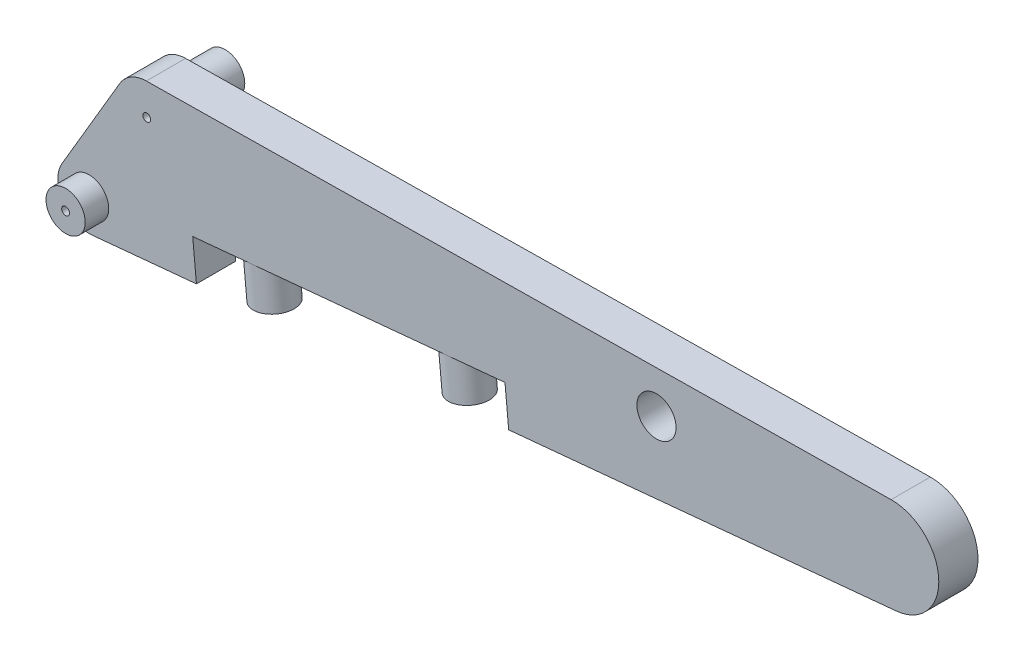
ISO-10303-21;
HEADER;
FILE_DESCRIPTION(('STEP AP214'),'2;1');
FILE_NAME('part.step','',(''),(''),'','','');
FILE_SCHEMA(('AUTOMOTIVE_DESIGN { 1 0 10303 214 1 1 1 1 }'));
ENDSEC;
DATA;
#1=APPLICATION_CONTEXT('core data for automotive mechanical design processes');
#2=APPLICATION_PROTOCOL_DEFINITION('international standard','automotive_design',2000,#1);
#3=PRODUCT_CONTEXT('',#1,'mechanical');
#4=PRODUCT('Part','Part','',(#3));
#5=PRODUCT_RELATED_PRODUCT_CATEGORY('part','',(#4));
#6=PRODUCT_DEFINITION_FORMATION('','',#4);
#7=PRODUCT_DEFINITION_CONTEXT('part definition',#1,'design');
#8=PRODUCT_DEFINITION('design','',#6,#7);
#9=PRODUCT_DEFINITION_SHAPE('','',#8);
#10=(LENGTH_UNIT() NAMED_UNIT(*) SI_UNIT(.MILLI.,.METRE.));
#11=(NAMED_UNIT(*) PLANE_ANGLE_UNIT() SI_UNIT($,.RADIAN.));
#12=(NAMED_UNIT(*) SI_UNIT($,.STERADIAN.) SOLID_ANGLE_UNIT());
#13=UNCERTAINTY_MEASURE_WITH_UNIT(LENGTH_MEASURE(1.E-05),#10,'distance_accuracy_value','');
#14=(GEOMETRIC_REPRESENTATION_CONTEXT(3) GLOBAL_UNCERTAINTY_ASSIGNED_CONTEXT((#13)) GLOBAL_UNIT_ASSIGNED_CONTEXT((#10,
#11,#12)) REPRESENTATION_CONTEXT('',''));
#15=CARTESIAN_POINT('',(0.,0.,0.));
#16=DIRECTION('',(0.,0.,1.));
#17=DIRECTION('',(1.,0.,0.));
#18=AXIS2_PLACEMENT_3D('',#15,#16,#17);
#19=CARTESIAN_POINT('',(45.6773871437148,-6.42439484978395,5.));
#20=DIRECTION('',(-0.0947770680531277,0.995498522033686,0.));
#21=DIRECTION('',(-0.995498522033686,-0.0947770680531277,0.));
#22=AXIS2_PLACEMENT_3D('',#19,#20,#21);
#23=PLANE('',#22);
#24=CARTESIAN_POINT('',(38.2111482284621,-7.13522286018241,2.5));
#25=DIRECTION('',(0.0947770680531277,-0.995498522033686,0.));
#26=DIRECTION('',(0.995498522033686,0.0947770680531277,0.));
#27=AXIS2_PLACEMENT_3D('',#24,#25,#26);
#28=CIRCLE('',#27,2.5);
#29=CARTESIAN_POINT('',(38.2111482284621,-7.13522286018241,0.));
#30=VERTEX_POINT('',#29);
#31=CARTESIAN_POINT('',(38.2111482284621,-7.1352228601824,5.));
#32=VERTEX_POINT('',#31);
#33=EDGE_CURVE('E142',#30,#32,#28,.T.);
#34=ORIENTED_EDGE('',*,*,#33,.F.);
#35=DIRECTION('',(0.995498522033686,0.0947770680531277,0.));
#36=VECTOR('',#35,1.);
#37=CARTESIAN_POINT('',(45.6773871437148,-6.42439484978395,0.));
#38=LINE('',#37,#36);
#39=CARTESIAN_POINT('',(45.6773871437148,-6.42439484978395,0.));
#40=VERTEX_POINT('',#39);
#41=EDGE_CURVE('E129',#30,#40,#38,.T.);
#42=ORIENTED_EDGE('',*,*,#41,.T.);
#43=DIRECTION('',(0.,0.,-1.));
#44=VECTOR('',#43,1.);
#45=CARTESIAN_POINT('',(45.6773871437148,-6.42439484978395,5.));
#46=LINE('',#45,#44);
#47=CARTESIAN_POINT('',(45.6773871437148,-6.42439484978395,5.));
#48=VERTEX_POINT('',#47);
#49=EDGE_CURVE('E178',#48,#40,#46,.T.);
#50=ORIENTED_EDGE('',*,*,#49,.F.);
#51=DIRECTION('',(0.995498522033686,0.0947770680531277,0.));
#52=VECTOR('',#51,1.);
#53=CARTESIAN_POINT('',(45.6773871437148,-6.42439484978395,5.));
#54=LINE('',#53,#52);
#55=EDGE_CURVE('E143',#32,#48,#54,.T.);
#56=ORIENTED_EDGE('',*,*,#55,.F.);
#57=EDGE_LOOP('',(#34,#42,#50,#56));
#58=FACE_BOUND('',#57,.T.);
#59=ADVANCED_FACE('F34',(#58),#23,.F.);
#60=EDGE_CURVE('E49',#32,#30,#28,.T.);
#61=ORIENTED_EDGE('',*,*,#60,.F.);
#62=CARTESIAN_POINT('',(13.32368517762,-9.5046495615106,5.));
#63=VERTEX_POINT('',#62);
#64=EDGE_CURVE('E174',#63,#32,#54,.T.);
#65=ORIENTED_EDGE('',*,*,#64,.F.);
#66=CARTESIAN_POINT('',(13.32368517762,-9.5046495615106,2.5));
#67=DIRECTION('',(-0.0947770680531277,0.995498522033686,0.));
#68=DIRECTION('',(-0.995498522033686,-0.0947770680531277,0.));
#69=AXIS2_PLACEMENT_3D('',#66,#67,#68);
#70=CIRCLE('',#69,2.5);
#71=CARTESIAN_POINT('',(13.32368517762,-9.5046495615106,0.));
#72=VERTEX_POINT('',#71);
#73=EDGE_CURVE('E11',#72,#63,#70,.F.);
#74=ORIENTED_EDGE('',*,*,#73,.F.);
#75=EDGE_CURVE('E123',#72,#30,#38,.T.);
#76=ORIENTED_EDGE('',*,*,#75,.T.);
#77=EDGE_LOOP('',(#61,#65,#74,#76));
#78=FACE_BOUND('',#77,.T.);
#79=ADVANCED_FACE('F125',(#78),#23,.F.);
#80=CARTESIAN_POINT('',(95.5686624083188,-6.71978491513121,5.));
#81=DIRECTION('',(-0.0947770680531279,0.995498522033686,0.));
#82=DIRECTION('',(-0.995498522033686,-0.0947770680531279,0.));
#83=AXIS2_PLACEMENT_3D('',#80,#81,#82);
#84=PLANE('',#83);
#85=DIRECTION('',(0.995498522033686,0.0947770680531279,0.));
#86=VECTOR('',#85,1.);
#87=CARTESIAN_POINT('',(95.5686624083188,-6.71978491513121,5.));
#88=LINE('',#87,#86);
#89=CARTESIAN_POINT('',(46.1534153143016,-11.4243948497839,5.));
#90=VERTEX_POINT('',#89);
#91=CARTESIAN_POINT('',(95.5686624083188,-6.71978491513121,5.));
#92=VERTEX_POINT('',#91);
#93=EDGE_CURVE('E225',#90,#92,#88,.T.);
#94=ORIENTED_EDGE('',*,*,#93,.F.);
#95=DIRECTION('',(0.,0.,-1.));
#96=VECTOR('',#95,1.);
#97=CARTESIAN_POINT('',(46.1534153143016,-11.4243948497839,5.));
#98=LINE('',#97,#96);
#99=CARTESIAN_POINT('',(46.1534153143016,-11.4243948497839,0.));
#100=VERTEX_POINT('',#99);
#101=EDGE_CURVE('E173',#90,#100,#98,.T.);
#102=ORIENTED_EDGE('',*,*,#101,.T.);
#103=DIRECTION('',(0.995498522033686,0.0947770680531279,0.));
#104=VECTOR('',#103,1.);
#105=CARTESIAN_POINT('',(95.5686624083188,-6.71978491513121,0.));
#106=LINE('',#105,#104);
#107=CARTESIAN_POINT('',(95.5686624083188,-6.71978491513121,0.));
#108=VERTEX_POINT('',#107);
#109=EDGE_CURVE('E240',#100,#108,#106,.T.);
#110=ORIENTED_EDGE('',*,*,#109,.T.);
#111=DIRECTION('',(0.,0.,-1.));
#112=VECTOR('',#111,1.);
#113=CARTESIAN_POINT('',(95.5686624083188,-6.71978491513121,5.));
#114=LINE('',#113,#112);
#115=EDGE_CURVE('E252',#92,#108,#114,.T.);
#116=ORIENTED_EDGE('',*,*,#115,.F.);
#117=EDGE_LOOP('',(#94,#102,#110,#116));
#118=FACE_BOUND('',#117,.T.);
#119=ADVANCED_FACE('F295',(#118),#84,.F.);
#120=CARTESIAN_POINT('',(0.,0.,5.));
#121=DIRECTION('',(0.,0.,1.));
#122=DIRECTION('',(1.,0.,0.));
#123=AXIS2_PLACEMENT_3D('',#120,#121,#122);
#124=PLANE('',#123);
#125=DIRECTION('',(0.0947770680531279,-0.995498522033686,0.));
#126=VECTOR('',#125,1.);
#127=CARTESIAN_POINT('',(46.1534153143016,-11.4243948497839,5.));
#128=LINE('',#127,#126);
#129=EDGE_CURVE('E164',#48,#90,#128,.T.);
#130=ORIENTED_EDGE('',*,*,#129,.T.);
#131=ORIENTED_EDGE('',*,*,#93,.T.);
#132=CARTESIAN_POINT('',(95.,-0.746793782929099,5.));
#133=DIRECTION('',(0.,0.,1.));
#134=DIRECTION('',(1.,0.,0.));
#135=AXIS2_PLACEMENT_3D('',#132,#133,#134);
#136=CIRCLE('',#135,6.);
#137=CARTESIAN_POINT('',(94.9208460291597,5.25268408176048,5.));
#138=VERTEX_POINT('',#137);
#139=EDGE_CURVE('E229',#92,#138,#136,.T.);
#140=ORIENTED_EDGE('',*,*,#139,.T.);
#141=DIRECTION('',(-0.999912977448263,-0.0131923284733843,0.));
#142=VECTOR('',#141,1.);
#143=CARTESIAN_POINT('',(-0.0527693138935375,3.99965190979305,5.));
#144=LINE('',#143,#142);
#145=CARTESIAN_POINT('',(-0.0527693138935375,3.99965190979305,5.));
#146=VERTEX_POINT('',#145);
#147=EDGE_CURVE('E231',#138,#146,#144,.T.);
#148=ORIENTED_EDGE('',*,*,#147,.T.);
#149=CARTESIAN_POINT('',(0.,0.,5.));
#150=DIRECTION('',(0.,0.,1.));
#151=DIRECTION('',(1.,0.,0.));
#152=AXIS2_PLACEMENT_3D('',#149,#150,#151);
#153=CIRCLE('',#152,4.);
#154=CARTESIAN_POINT('',(-3.44827309918196,2.02716862482085,5.));
#155=VERTEX_POINT('',#154);
#156=EDGE_CURVE('E217',#146,#155,#153,.T.);
#157=ORIENTED_EDGE('',*,*,#156,.T.);
#158=DIRECTION('',(-0.506792156205211,-0.86206827479549,0.));
#159=VECTOR('',#158,1.);
#160=CARTESIAN_POINT('',(-10.7967593641575,-10.4728213597138,5.));
#161=LINE('',#160,#159);
#162=CARTESIAN_POINT('',(-10.7967593641575,-10.4728213597138,5.));
#163=VERTEX_POINT('',#162);
#164=EDGE_CURVE('E220',#155,#163,#161,.T.);
#165=ORIENTED_EDGE('',*,*,#164,.T.);
#166=CARTESIAN_POINT('',(-7.34848626497557,-12.4999899845346,5.));
#167=DIRECTION('',(0.,0.,1.));
#168=DIRECTION('',(1.,0.,0.));
#169=AXIS2_PLACEMENT_3D('',#166,#167,#168);
#170=CIRCLE('',#169,4.);
#171=CARTESIAN_POINT('',(-6.96937799276305,-16.4819840726693,5.));
#172=VERTEX_POINT('',#171);
#173=EDGE_CURVE('E223',#163,#172,#170,.T.);
#174=ORIENTED_EDGE('',*,*,#173,.T.);
#175=CARTESIAN_POINT('',(6.33347443295429,-15.215477571909,5.));
#176=VERTEX_POINT('',#175);
#177=EDGE_CURVE('E226',#172,#176,#88,.T.);
#178=ORIENTED_EDGE('',*,*,#177,.T.);
#179=DIRECTION('',(-0.0947770680531273,0.995498522033686,0.));
#180=VECTOR('',#179,1.);
#181=CARTESIAN_POINT('',(6.3334744329542,-15.2154775719091,5.));
#182=LINE('',#181,#180);
#183=CARTESIAN_POINT('',(5.85744626236732,-10.2154775719091,5.));
#184=VERTEX_POINT('',#183);
#185=EDGE_CURVE('E167',#176,#184,#182,.T.);
#186=ORIENTED_EDGE('',*,*,#185,.T.);
#187=EDGE_CURVE('E170',#184,#63,#54,.T.);
#188=ORIENTED_EDGE('',*,*,#187,.T.);
#189=ORIENTED_EDGE('',*,*,#64,.T.);
#190=ORIENTED_EDGE('',*,*,#55,.T.);
#191=EDGE_LOOP('',(#130,#131,#140,#148,#157,#165,#174,#178,#186,#188,#189,#190));
#192=FACE_BOUND('',#191,.T.);
#193=CARTESIAN_POINT('',(65.,-0.510964167267279,5.));
#194=DIRECTION('',(0.,0.,-1.));
#195=DIRECTION('',(-1.,0.,0.));
#196=AXIS2_PLACEMENT_3D('',#193,#194,#195);
#197=CIRCLE('',#196,2.49999999999999);
#198=CARTESIAN_POINT('',(62.5,-0.510964167267279,5.));
#199=VERTEX_POINT('',#198);
#200=EDGE_CURVE('E187',#199,#199,#197,.T.);
#201=ORIENTED_EDGE('',*,*,#200,.T.);
#202=EDGE_LOOP('',(#201));
#203=FACE_BOUND('',#202,.T.);
#204=CARTESIAN_POINT('',(-7.34848626497557,-12.4999899845346,5.));
#205=DIRECTION('',(0.,0.,1.));
#206=DIRECTION('',(1.,0.,0.));
#207=AXIS2_PLACEMENT_3D('',#204,#205,#206);
#208=CIRCLE('',#207,2.5);
#209=CARTESIAN_POINT('',(-4.84848626497556,-12.4999899845346,5.));
#210=VERTEX_POINT('',#209);
#211=EDGE_CURVE('E213',#210,#210,#208,.T.);
#212=ORIENTED_EDGE('',*,*,#211,.F.);
#213=EDGE_LOOP('',(#212));
#214=FACE_BOUND('',#213,.T.);
#215=CARTESIAN_POINT('',(0.,0.,5.));
#216=DIRECTION('',(0.,0.,1.));
#217=DIRECTION('',(1.,0.,0.));
#218=AXIS2_PLACEMENT_3D('',#215,#216,#217);
#219=CIRCLE('',#218,0.5);
#220=CARTESIAN_POINT('',(0.5,0.,5.));
#221=VERTEX_POINT('',#220);
#222=EDGE_CURVE('E201',#221,#221,#219,.T.);
#223=ORIENTED_EDGE('',*,*,#222,.F.);
#224=EDGE_LOOP('',(#223));
#225=FACE_BOUND('',#224,.T.);
#226=ADVANCED_FACE('F283',(#192,#203,#214,#225),#124,.T.);
#227=CARTESIAN_POINT('',(0.,0.,0.));
#228=DIRECTION('',(0.,0.,1.));
#229=DIRECTION('',(1.,0.,0.));
#230=AXIS2_PLACEMENT_3D('',#227,#228,#229);
#231=PLANE('',#230);
#232=CARTESIAN_POINT('',(65.,-0.510964167267279,0.));
#233=DIRECTION('',(0.,0.,-1.));
#234=DIRECTION('',(-1.,0.,0.));
#235=AXIS2_PLACEMENT_3D('',#232,#233,#234);
#236=CIRCLE('',#235,2.49999999999999);
#237=CARTESIAN_POINT('',(62.5,-0.510964167267279,0.));
#238=VERTEX_POINT('',#237);
#239=EDGE_CURVE('E180',#238,#238,#236,.T.);
#240=ORIENTED_EDGE('',*,*,#239,.F.);
#241=EDGE_LOOP('',(#240));
#242=FACE_BOUND('',#241,.T.);
#243=ORIENTED_EDGE('',*,*,#109,.F.);
#244=DIRECTION('',(0.0947770680531279,-0.995498522033686,0.));
#245=VECTOR('',#244,1.);
#246=CARTESIAN_POINT('',(46.1534153143016,-11.4243948497839,0.));
#247=LINE('',#246,#245);
#248=EDGE_CURVE('E136',#40,#100,#247,.T.);
#249=ORIENTED_EDGE('',*,*,#248,.F.);
#250=ORIENTED_EDGE('',*,*,#41,.F.);
#251=ORIENTED_EDGE('',*,*,#75,.F.);
#252=CARTESIAN_POINT('',(5.85744626236732,-10.2154775719091,0.));
#253=VERTEX_POINT('',#252);
#254=EDGE_CURVE('E128',#253,#72,#38,.T.);
#255=ORIENTED_EDGE('',*,*,#254,.F.);
#256=DIRECTION('',(-0.0947770680531273,0.995498522033686,0.));
#257=VECTOR('',#256,1.);
#258=CARTESIAN_POINT('',(6.3334744329542,-15.2154775719091,0.));
#259=LINE('',#258,#257);
#260=CARTESIAN_POINT('',(6.3334744329542,-15.2154775719091,0.));
#261=VERTEX_POINT('',#260);
#262=EDGE_CURVE('E140',#261,#253,#259,.T.);
#263=ORIENTED_EDGE('',*,*,#262,.F.);
#264=CARTESIAN_POINT('',(-6.96937799276305,-16.4819840726693,0.));
#265=VERTEX_POINT('',#264);
#266=EDGE_CURVE('E241',#265,#261,#106,.T.);
#267=ORIENTED_EDGE('',*,*,#266,.F.);
#268=CARTESIAN_POINT('',(-7.34848626497557,-12.4999899845346,0.));
#269=DIRECTION('',(0.,0.,1.));
#270=DIRECTION('',(1.,0.,0.));
#271=AXIS2_PLACEMENT_3D('',#268,#269,#270);
#272=CIRCLE('',#271,4.);
#273=CARTESIAN_POINT('',(-10.7967593641575,-10.4728213597138,0.));
#274=VERTEX_POINT('',#273);
#275=EDGE_CURVE('E238',#274,#265,#272,.T.);
#276=ORIENTED_EDGE('',*,*,#275,.F.);
#277=DIRECTION('',(-0.506792156205211,-0.86206827479549,0.));
#278=VECTOR('',#277,1.);
#279=CARTESIAN_POINT('',(-10.7967593641575,-10.4728213597138,0.));
#280=LINE('',#279,#278);
#281=CARTESIAN_POINT('',(-3.44827309918196,2.02716862482085,0.));
#282=VERTEX_POINT('',#281);
#283=EDGE_CURVE('E236',#282,#274,#280,.T.);
#284=ORIENTED_EDGE('',*,*,#283,.F.);
#285=CARTESIAN_POINT('',(0.,0.,0.));
#286=DIRECTION('',(0.,0.,1.));
#287=DIRECTION('',(1.,0.,0.));
#288=AXIS2_PLACEMENT_3D('',#285,#286,#287);
#289=CIRCLE('',#288,4.);
#290=CARTESIAN_POINT('',(-0.0527693138935375,3.99965190979305,0.));
#291=VERTEX_POINT('',#290);
#292=EDGE_CURVE('E216',#291,#282,#289,.T.);
#293=ORIENTED_EDGE('',*,*,#292,.F.);
#294=DIRECTION('',(-0.999912977448263,-0.0131923284733843,0.));
#295=VECTOR('',#294,1.);
#296=CARTESIAN_POINT('',(-0.0527693138935375,3.99965190979305,0.));
#297=LINE('',#296,#295);
#298=CARTESIAN_POINT('',(94.9208460291597,5.25268408176048,0.));
#299=VERTEX_POINT('',#298);
#300=EDGE_CURVE('E221',#299,#291,#297,.T.);
#301=ORIENTED_EDGE('',*,*,#300,.F.);
#302=CARTESIAN_POINT('',(95.,-0.746793782929099,0.));
#303=DIRECTION('',(0.,0.,1.));
#304=DIRECTION('',(1.,0.,0.));
#305=AXIS2_PLACEMENT_3D('',#302,#303,#304);
#306=CIRCLE('',#305,6.);
#307=EDGE_CURVE('E244',#108,#299,#306,.T.);
#308=ORIENTED_EDGE('',*,*,#307,.F.);
#309=EDGE_LOOP('',(#243,#249,#250,#251,#255,#263,#267,#276,#284,#293,#301,#308));
#310=FACE_BOUND('',#309,.T.);
#311=CARTESIAN_POINT('',(0.,0.,0.));
#312=DIRECTION('',(0.,0.,1.));
#313=DIRECTION('',(1.,0.,0.));
#314=AXIS2_PLACEMENT_3D('',#311,#312,#313);
#315=CIRCLE('',#314,2.5);
#316=CARTESIAN_POINT('',(2.5,0.,0.));
#317=VERTEX_POINT('',#316);
#318=EDGE_CURVE('E210',#317,#317,#315,.T.);
#319=ORIENTED_EDGE('',*,*,#318,.T.);
#320=EDGE_LOOP('',(#319));
#321=FACE_BOUND('',#320,.T.);
#322=CARTESIAN_POINT('',(-7.34848626497557,-12.4999899845346,0.));
#323=DIRECTION('',(0.,0.,-1.));
#324=DIRECTION('',(-1.,0.,0.));
#325=AXIS2_PLACEMENT_3D('',#322,#323,#324);
#326=CIRCLE('',#325,0.500000000000001);
#327=CARTESIAN_POINT('',(-7.84848626497557,-12.4999899845346,0.));
#328=VERTEX_POINT('',#327);
#329=EDGE_CURVE('E190',#328,#328,#326,.T.);
#330=ORIENTED_EDGE('',*,*,#329,.F.);
#331=EDGE_LOOP('',(#330));
#332=FACE_BOUND('',#331,.T.);
#333=ADVANCED_FACE('F134',(#242,#310,#321,#332),#231,.F.);
#334=CARTESIAN_POINT('',(0.,0.,5.));
#335=DIRECTION('',(0.,0.,-1.));
#336=DIRECTION('',(-1.,0.,0.));
#337=AXIS2_PLACEMENT_3D('',#334,#335,#336);
#338=CYLINDRICAL_SURFACE('',#337,4.);
#339=ORIENTED_EDGE('',*,*,#292,.T.);
#340=DIRECTION('',(0.,0.,-1.));
#341=VECTOR('',#340,1.);
#342=CARTESIAN_POINT('',(-3.44827309918196,2.02716862482085,5.));
#343=LINE('',#342,#341);
#344=EDGE_CURVE('E42',#155,#282,#343,.T.);
#345=ORIENTED_EDGE('',*,*,#344,.F.);
#346=ORIENTED_EDGE('',*,*,#156,.F.);
#347=DIRECTION('',(0.,0.,-1.));
#348=VECTOR('',#347,1.);
#349=CARTESIAN_POINT('',(-0.0527693138935375,3.99965190979305,5.));
#350=LINE('',#349,#348);
#351=EDGE_CURVE('E233',#146,#291,#350,.T.);
#352=ORIENTED_EDGE('',*,*,#351,.T.);
#353=EDGE_LOOP('',(#339,#345,#346,#352));
#354=FACE_BOUND('',#353,.T.);
#355=ADVANCED_FACE('F36',(#354),#338,.T.);
#356=CARTESIAN_POINT('',(-10.7967593641575,-10.4728213597138,5.));
#357=DIRECTION('',(0.86206827479549,-0.506792156205211,0.));
#358=DIRECTION('',(0.506792156205211,0.86206827479549,0.));
#359=AXIS2_PLACEMENT_3D('',#356,#357,#358);
#360=PLANE('',#359);
#361=ORIENTED_EDGE('',*,*,#283,.T.);
#362=DIRECTION('',(0.,0.,-1.));
#363=VECTOR('',#362,1.);
#364=CARTESIAN_POINT('',(-10.7967593641575,-10.4728213597138,5.));
#365=LINE('',#364,#363);
#366=EDGE_CURVE('E258',#163,#274,#365,.T.);
#367=ORIENTED_EDGE('',*,*,#366,.F.);
#368=ORIENTED_EDGE('',*,*,#164,.F.);
#369=ORIENTED_EDGE('',*,*,#344,.T.);
#370=EDGE_LOOP('',(#361,#367,#368,#369));
#371=FACE_BOUND('',#370,.T.);
#372=ADVANCED_FACE('F263',(#371),#360,.F.);
#373=CARTESIAN_POINT('',(-7.34848626497557,-12.4999899845346,5.));
#374=DIRECTION('',(0.,0.,-1.));
#375=DIRECTION('',(-1.,0.,0.));
#376=AXIS2_PLACEMENT_3D('',#373,#374,#375);
#377=CYLINDRICAL_SURFACE('',#376,4.);
#378=ORIENTED_EDGE('',*,*,#275,.T.);
#379=DIRECTION('',(0.,0.,-1.));
#380=VECTOR('',#379,1.);
#381=CARTESIAN_POINT('',(-6.96937799276305,-16.4819840726693,5.));
#382=LINE('',#381,#380);
#383=EDGE_CURVE('E255',#172,#265,#382,.T.);
#384=ORIENTED_EDGE('',*,*,#383,.F.);
#385=ORIENTED_EDGE('',*,*,#173,.F.);
#386=ORIENTED_EDGE('',*,*,#366,.T.);
#387=EDGE_LOOP('',(#378,#384,#385,#386));
#388=FACE_BOUND('',#387,.T.);
#389=ADVANCED_FACE('F276',(#388),#377,.T.);
#390=ORIENTED_EDGE('',*,*,#266,.T.);
#391=DIRECTION('',(0.,0.,-1.));
#392=VECTOR('',#391,1.);
#393=CARTESIAN_POINT('',(6.3334744329542,-15.2154775719091,5.));
#394=LINE('',#393,#392);
#395=EDGE_CURVE('E183',#176,#261,#394,.T.);
#396=ORIENTED_EDGE('',*,*,#395,.F.);
#397=ORIENTED_EDGE('',*,*,#177,.F.);
#398=ORIENTED_EDGE('',*,*,#383,.T.);
#399=EDGE_LOOP('',(#390,#396,#397,#398));
#400=FACE_BOUND('',#399,.T.);
#401=ADVANCED_FACE('F280',(#400),#84,.F.);
#402=CARTESIAN_POINT('',(95.,-0.746793782929099,5.));
#403=DIRECTION('',(0.,0.,-1.));
#404=DIRECTION('',(-1.,0.,0.));
#405=AXIS2_PLACEMENT_3D('',#402,#403,#404);
#406=CYLINDRICAL_SURFACE('',#405,6.);
#407=ORIENTED_EDGE('',*,*,#307,.T.);
#408=DIRECTION('',(0.,0.,-1.));
#409=VECTOR('',#408,1.);
#410=CARTESIAN_POINT('',(94.9208460291597,5.25268408176048,5.));
#411=LINE('',#410,#409);
#412=EDGE_CURVE('E249',#138,#299,#411,.T.);
#413=ORIENTED_EDGE('',*,*,#412,.F.);
#414=ORIENTED_EDGE('',*,*,#139,.F.);
#415=ORIENTED_EDGE('',*,*,#115,.T.);
#416=EDGE_LOOP('',(#407,#413,#414,#415));
#417=FACE_BOUND('',#416,.T.);
#418=ADVANCED_FACE('F291',(#417),#406,.T.);
#419=CARTESIAN_POINT('',(-0.0527693138935375,3.99965190979305,5.));
#420=DIRECTION('',(0.0131923284733843,-0.999912977448263,0.));
#421=DIRECTION('',(0.999912977448263,0.0131923284733843,0.));
#422=AXIS2_PLACEMENT_3D('',#419,#420,#421);
#423=PLANE('',#422);
#424=ORIENTED_EDGE('',*,*,#300,.T.);
#425=ORIENTED_EDGE('',*,*,#351,.F.);
#426=ORIENTED_EDGE('',*,*,#147,.F.);
#427=ORIENTED_EDGE('',*,*,#412,.T.);
#428=EDGE_LOOP('',(#424,#425,#426,#427));
#429=FACE_BOUND('',#428,.T.);
#430=ADVANCED_FACE('F289',(#429),#423,.F.);
#431=CARTESIAN_POINT('',(0.,0.,-5.));
#432=DIRECTION('',(0.,0.,1.));
#433=DIRECTION('',(1.,0.,0.));
#434=AXIS2_PLACEMENT_3D('',#431,#432,#433);
#435=CYLINDRICAL_SURFACE('',#434,2.5);
#436=CARTESIAN_POINT('',(0.,0.,-5.));
#437=DIRECTION('',(0.,0.,1.));
#438=DIRECTION('',(1.,0.,0.));
#439=AXIS2_PLACEMENT_3D('',#436,#437,#438);
#440=CIRCLE('',#439,2.5);
#441=CARTESIAN_POINT('',(2.5,0.,-5.));
#442=VERTEX_POINT('',#441);
#443=EDGE_CURVE('E205',#442,#442,#440,.T.);
#444=ORIENTED_EDGE('',*,*,#443,.T.);
#445=EDGE_LOOP('',(#444));
#446=FACE_BOUND('',#445,.T.);
#447=ORIENTED_EDGE('',*,*,#318,.F.);
#448=EDGE_LOOP('',(#447));
#449=FACE_BOUND('',#448,.T.);
#450=ADVANCED_FACE('F497',(#446,#449),#435,.T.);
#451=CARTESIAN_POINT('',(0.,0.,-5.));
#452=DIRECTION('',(0.,0.,1.));
#453=DIRECTION('',(1.,0.,0.));
#454=AXIS2_PLACEMENT_3D('',#451,#452,#453);
#455=PLANE('',#454);
#456=CARTESIAN_POINT('',(0.,0.,-5.));
#457=DIRECTION('',(0.,0.,1.));
#458=DIRECTION('',(1.,0.,0.));
#459=AXIS2_PLACEMENT_3D('',#456,#457,#458);
#460=CIRCLE('',#459,0.5);
#461=CARTESIAN_POINT('',(0.5,0.,-5.));
#462=VERTEX_POINT('',#461);
#463=EDGE_CURVE('E202',#462,#462,#460,.T.);
#464=ORIENTED_EDGE('',*,*,#463,.T.);
#465=EDGE_LOOP('',(#464));
#466=FACE_BOUND('',#465,.T.);
#467=ORIENTED_EDGE('',*,*,#443,.F.);
#468=EDGE_LOOP('',(#467));
#469=FACE_BOUND('',#468,.T.);
#470=ADVANCED_FACE('F488',(#466,#469),#455,.F.);
#471=CARTESIAN_POINT('',(0.,0.,-5.));
#472=DIRECTION('',(0.,0.,1.));
#473=DIRECTION('',(1.,0.,0.));
#474=AXIS2_PLACEMENT_3D('',#471,#472,#473);
#475=CYLINDRICAL_SURFACE('',#474,0.5);
#476=ORIENTED_EDGE('',*,*,#463,.F.);
#477=EDGE_LOOP('',(#476));
#478=FACE_BOUND('',#477,.T.);
#479=ORIENTED_EDGE('',*,*,#222,.T.);
#480=EDGE_LOOP('',(#479));
#481=FACE_BOUND('',#480,.T.);
#482=ADVANCED_FACE('F466',(#478,#481),#475,.F.);
#483=CARTESIAN_POINT('',(-7.34848626497557,-12.4999899845346,8.));
#484=DIRECTION('',(0.,0.,-1.));
#485=DIRECTION('',(-1.,0.,0.));
#486=AXIS2_PLACEMENT_3D('',#483,#484,#485);
#487=CYLINDRICAL_SURFACE('',#486,2.5);
#488=ORIENTED_EDGE('',*,*,#211,.T.);
#489=EDGE_LOOP('',(#488));
#490=FACE_BOUND('',#489,.T.);
#491=CARTESIAN_POINT('',(-7.34848626497557,-12.4999899845346,8.));
#492=DIRECTION('',(0.,0.,-1.));
#493=DIRECTION('',(-1.,0.,0.));
#494=AXIS2_PLACEMENT_3D('',#491,#492,#493);
#495=CIRCLE('',#494,2.5);
#496=CARTESIAN_POINT('',(-9.84848626497557,-12.4999899845346,8.));
#497=VERTEX_POINT('',#496);
#498=EDGE_CURVE('E196',#497,#497,#495,.T.);
#499=ORIENTED_EDGE('',*,*,#498,.T.);
#500=EDGE_LOOP('',(#499));
#501=FACE_BOUND('',#500,.T.);
#502=ADVANCED_FACE('F457',(#490,#501),#487,.T.);
#503=CARTESIAN_POINT('',(-7.34848626497557,-12.4999899845346,8.));
#504=DIRECTION('',(0.,0.,-1.));
#505=DIRECTION('',(-1.,0.,0.));
#506=AXIS2_PLACEMENT_3D('',#503,#504,#505);
#507=PLANE('',#506);
#508=CARTESIAN_POINT('',(-7.34848626497557,-12.4999899845346,8.));
#509=DIRECTION('',(0.,0.,-1.));
#510=DIRECTION('',(-1.,0.,0.));
#511=AXIS2_PLACEMENT_3D('',#508,#509,#510);
#512=CIRCLE('',#511,0.500000000000001);
#513=CARTESIAN_POINT('',(-7.84848626497557,-12.4999899845346,8.));
#514=VERTEX_POINT('',#513);
#515=EDGE_CURVE('E193',#514,#514,#512,.T.);
#516=ORIENTED_EDGE('',*,*,#515,.T.);
#517=EDGE_LOOP('',(#516));
#518=FACE_BOUND('',#517,.T.);
#519=ORIENTED_EDGE('',*,*,#498,.F.);
#520=EDGE_LOOP('',(#519));
#521=FACE_BOUND('',#520,.T.);
#522=ADVANCED_FACE('F448',(#518,#521),#507,.F.);
#523=CARTESIAN_POINT('',(-7.34848626497557,-12.4999899845346,8.));
#524=DIRECTION('',(0.,0.,-1.));
#525=DIRECTION('',(-1.,0.,0.));
#526=AXIS2_PLACEMENT_3D('',#523,#524,#525);
#527=CYLINDRICAL_SURFACE('',#526,0.500000000000001);
#528=ORIENTED_EDGE('',*,*,#515,.F.);
#529=EDGE_LOOP('',(#528));
#530=FACE_BOUND('',#529,.T.);
#531=ORIENTED_EDGE('',*,*,#329,.T.);
#532=EDGE_LOOP('',(#531));
#533=FACE_BOUND('',#532,.T.);
#534=ADVANCED_FACE('F439',(#530,#533),#527,.F.);
#535=CARTESIAN_POINT('',(65.,-0.510964167267279,5.));
#536=DIRECTION('',(0.,0.,-1.));
#537=DIRECTION('',(-1.,0.,0.));
#538=AXIS2_PLACEMENT_3D('',#535,#536,#537);
#539=CYLINDRICAL_SURFACE('',#538,2.49999999999999);
#540=ORIENTED_EDGE('',*,*,#200,.F.);
#541=EDGE_LOOP('',(#540));
#542=FACE_BOUND('',#541,.T.);
#543=ORIENTED_EDGE('',*,*,#239,.T.);
#544=EDGE_LOOP('',(#543));
#545=FACE_BOUND('',#544,.T.);
#546=ADVANCED_FACE('F334',(#542,#545),#539,.F.);
#547=CARTESIAN_POINT('',(46.1534153143016,-11.4243948497839,5.));
#548=DIRECTION('',(0.995498522033686,0.0947770680531279,0.));
#549=DIRECTION('',(-0.0947770680531279,0.995498522033686,0.));
#550=AXIS2_PLACEMENT_3D('',#547,#548,#549);
#551=PLANE('',#550);
#552=ORIENTED_EDGE('',*,*,#248,.T.);
#553=ORIENTED_EDGE('',*,*,#101,.F.);
#554=ORIENTED_EDGE('',*,*,#129,.F.);
#555=ORIENTED_EDGE('',*,*,#49,.T.);
#556=EDGE_LOOP('',(#552,#553,#554,#555));
#557=FACE_BOUND('',#556,.T.);
#558=ADVANCED_FACE('F298',(#557),#551,.F.);
#559=CARTESIAN_POINT('',(13.32368517762,-9.5046495615106,2.5));
#560=DIRECTION('',(0.0947770680531277,-0.995498522033686,0.));
#561=DIRECTION('',(0.995498522033686,0.0947770680531277,0.));
#562=AXIS2_PLACEMENT_3D('',#559,#560,#561);
#563=CIRCLE('',#562,2.5);
#564=EDGE_CURVE('E57',#63,#72,#563,.T.);
#565=ORIENTED_EDGE('',*,*,#564,.F.);
#566=ORIENTED_EDGE('',*,*,#187,.F.);
#567=DIRECTION('',(0.,0.,-1.));
#568=VECTOR('',#567,1.);
#569=CARTESIAN_POINT('',(5.85744626236732,-10.2154775719091,5.));
#570=LINE('',#569,#568);
#571=EDGE_CURVE('E181',#184,#253,#570,.T.);
#572=ORIENTED_EDGE('',*,*,#571,.T.);
#573=ORIENTED_EDGE('',*,*,#254,.T.);
#574=EDGE_LOOP('',(#565,#566,#572,#573));
#575=FACE_BOUND('',#574,.T.);
#576=ADVANCED_FACE('F320',(#575),#23,.F.);
#577=CARTESIAN_POINT('',(6.3334744329542,-15.2154775719091,5.));
#578=DIRECTION('',(-0.995498522033686,-0.0947770680531273,0.));
#579=DIRECTION('',(0.0947770680531273,-0.995498522033686,0.));
#580=AXIS2_PLACEMENT_3D('',#577,#578,#579);
#581=PLANE('',#580);
#582=ORIENTED_EDGE('',*,*,#262,.T.);
#583=ORIENTED_EDGE('',*,*,#571,.F.);
#584=ORIENTED_EDGE('',*,*,#185,.F.);
#585=ORIENTED_EDGE('',*,*,#395,.T.);
#586=EDGE_LOOP('',(#582,#583,#584,#585));
#587=FACE_BOUND('',#586,.T.);
#588=ADVANCED_FACE('F313',(#587),#581,.F.);
#589=CARTESIAN_POINT('',(13.7975705178856,-14.482142171679,2.5));
#590=DIRECTION('',(0.0947770680531277,-0.995498522033686,0.));
#591=DIRECTION('',(0.995498522033686,0.0947770680531277,0.));
#592=AXIS2_PLACEMENT_3D('',#589,#590,#591);
#593=PLANE('',#592);
#594=CARTESIAN_POINT('',(13.7975705178856,-14.482142171679,2.5));
#595=DIRECTION('',(0.0947770680531277,-0.995498522033686,0.));
#596=DIRECTION('',(0.995498522033686,0.0947770680531277,0.));
#597=AXIS2_PLACEMENT_3D('',#594,#595,#596);
#598=CIRCLE('',#597,2.5);
#599=CARTESIAN_POINT('',(16.2863168229698,-14.2451995015462,2.5));
#600=VERTEX_POINT('',#599);
#601=EDGE_CURVE('E160',#600,#600,#598,.T.);
#602=ORIENTED_EDGE('',*,*,#601,.T.);
#603=EDGE_LOOP('',(#602));
#604=FACE_BOUND('',#603,.T.);
#605=CARTESIAN_POINT('',(13.7975705178856,-14.482142171679,2.5));
#606=DIRECTION('',(0.0947770680531277,-0.995498522033686,0.));
#607=DIRECTION('',(0.995498522033686,0.0947770680531277,0.));
#608=AXIS2_PLACEMENT_3D('',#605,#606,#607);
#609=CIRCLE('',#608,0.5);
#610=CARTESIAN_POINT('',(14.2953197789025,-14.4347536376525,2.5));
#611=VERTEX_POINT('',#610);
#612=EDGE_CURVE('E155',#611,#611,#609,.T.);
#613=ORIENTED_EDGE('',*,*,#612,.F.);
#614=EDGE_LOOP('',(#613));
#615=FACE_BOUND('',#614,.T.);
#616=ADVANCED_FACE('F303',(#604,#615),#593,.T.);
#617=CARTESIAN_POINT('',(13.7975705178856,-14.482142171679,2.5));
#618=DIRECTION('',(-0.0947770680531277,0.995498522033686,0.));
#619=DIRECTION('',(-0.995498522033686,-0.0947770680531277,0.));
#620=AXIS2_PLACEMENT_3D('',#617,#618,#619);
#621=CYLINDRICAL_SURFACE('',#620,2.5);
#622=ORIENTED_EDGE('',*,*,#601,.F.);
#623=EDGE_LOOP('',(#622));
#624=FACE_BOUND('',#623,.T.);
#625=ORIENTED_EDGE('',*,*,#564,.T.);
#626=ORIENTED_EDGE('',*,*,#73,.T.);
#627=EDGE_LOOP('',(#625,#626));
#628=FACE_BOUND('',#627,.T.);
#629=ADVANCED_FACE('F300',(#624,#628),#621,.T.);
#630=CARTESIAN_POINT('',(13.7975705178856,-14.482142171679,2.5));
#631=DIRECTION('',(-0.0947770680531277,0.995498522033686,0.));
#632=DIRECTION('',(-0.995498522033686,-0.0947770680531277,0.));
#633=AXIS2_PLACEMENT_3D('',#630,#631,#632);
#634=CYLINDRICAL_SURFACE('',#633,0.5);
#635=ORIENTED_EDGE('',*,*,#612,.T.);
#636=EDGE_LOOP('',(#635));
#637=FACE_BOUND('',#636,.T.);
#638=CARTESIAN_POINT('',(13.32368517762,-9.5046495615106,2.5));
#639=DIRECTION('',(0.0947770680531277,-0.995498522033686,0.));
#640=DIRECTION('',(0.995498522033686,0.0947770680531277,0.));
#641=AXIS2_PLACEMENT_3D('',#638,#639,#640);
#642=CIRCLE('',#641,0.5);
#643=CARTESIAN_POINT('',(13.8214344386368,-9.45726102748404,2.5));
#644=VERTEX_POINT('',#643);
#645=EDGE_CURVE('E151',#644,#644,#642,.T.);
#646=ORIENTED_EDGE('',*,*,#645,.F.);
#647=EDGE_LOOP('',(#646));
#648=FACE_BOUND('',#647,.T.);
#649=ADVANCED_FACE('F302',(#637,#648),#634,.F.);
#650=ORIENTED_EDGE('',*,*,#645,.T.);
#651=EDGE_LOOP('',(#650));
#652=FACE_BOUND('',#651,.T.);
#653=ADVANCED_FACE('F310',(#652),#23,.F.);
#654=CARTESIAN_POINT('',(38.6850335687278,-12.1127154703508,2.5));
#655=DIRECTION('',(0.0947770680531277,-0.995498522033686,0.));
#656=DIRECTION('',(0.995498522033686,0.0947770680531277,0.));
#657=AXIS2_PLACEMENT_3D('',#654,#655,#656);
#658=PLANE('',#657);
#659=CARTESIAN_POINT('',(38.6850335687278,-12.1127154703508,2.5));
#660=DIRECTION('',(0.0947770680531277,-0.995498522033686,0.));
#661=DIRECTION('',(0.995498522033686,0.0947770680531277,0.));
#662=AXIS2_PLACEMENT_3D('',#659,#660,#661);
#663=CIRCLE('',#662,2.5);
#664=CARTESIAN_POINT('',(41.173779873812,-11.875772800218,2.5));
#665=VERTEX_POINT('',#664);
#666=EDGE_CURVE('E149',#665,#665,#663,.T.);
#667=ORIENTED_EDGE('',*,*,#666,.T.);
#668=EDGE_LOOP('',(#667));
#669=FACE_BOUND('',#668,.T.);
#670=CARTESIAN_POINT('',(38.6850335687278,-12.1127154703508,2.5));
#671=DIRECTION('',(0.0947770680531277,-0.995498522033686,0.));
#672=DIRECTION('',(0.995498522033686,0.0947770680531277,0.));
#673=AXIS2_PLACEMENT_3D('',#670,#671,#672);
#674=CIRCLE('',#673,0.499999999999998);
#675=CARTESIAN_POINT('',(39.1827828297446,-12.0653269363243,2.5));
#676=VERTEX_POINT('',#675);
#677=EDGE_CURVE('E146',#676,#676,#674,.T.);
#678=ORIENTED_EDGE('',*,*,#677,.F.);
#679=EDGE_LOOP('',(#678));
#680=FACE_BOUND('',#679,.T.);
#681=ADVANCED_FACE('F337',(#669,#680),#658,.T.);
#682=CARTESIAN_POINT('',(38.6850335687278,-12.1127154703508,2.5));
#683=DIRECTION('',(-0.0947770680531277,0.995498522033686,0.));
#684=DIRECTION('',(-0.995498522033686,-0.0947770680531277,0.));
#685=AXIS2_PLACEMENT_3D('',#682,#683,#684);
#686=CYLINDRICAL_SURFACE('',#685,2.5);
#687=ORIENTED_EDGE('',*,*,#666,.F.);
#688=EDGE_LOOP('',(#687));
#689=FACE_BOUND('',#688,.T.);
#690=ORIENTED_EDGE('',*,*,#60,.T.);
#691=ORIENTED_EDGE('',*,*,#33,.T.);
#692=EDGE_LOOP('',(#690,#691));
#693=FACE_BOUND('',#692,.T.);
#694=ADVANCED_FACE('F148',(#689,#693),#686,.T.);
#695=CARTESIAN_POINT('',(38.6850335687278,-12.1127154703508,2.5));
#696=DIRECTION('',(-0.0947770680531277,0.995498522033686,0.));
#697=DIRECTION('',(-0.995498522033686,-0.0947770680531277,0.));
#698=AXIS2_PLACEMENT_3D('',#695,#696,#697);
#699=CYLINDRICAL_SURFACE('',#698,0.499999999999998);
#700=ORIENTED_EDGE('',*,*,#677,.T.);
#701=EDGE_LOOP('',(#700));
#702=FACE_BOUND('',#701,.T.);
#703=CARTESIAN_POINT('',(38.2111482284621,-7.13522286018241,2.5));
#704=DIRECTION('',(0.0947770680531277,-0.995498522033686,0.));
#705=DIRECTION('',(0.995498522033686,0.0947770680531277,0.));
#706=AXIS2_PLACEMENT_3D('',#703,#704,#705);
#707=CIRCLE('',#706,0.499999999999998);
#708=CARTESIAN_POINT('',(38.708897489479,-7.08783432615585,2.5));
#709=VERTEX_POINT('',#708);
#710=EDGE_CURVE('E362',#709,#709,#707,.T.);
#711=ORIENTED_EDGE('',*,*,#710,.F.);
#712=EDGE_LOOP('',(#711));
#713=FACE_BOUND('',#712,.T.);
#714=ADVANCED_FACE('F326',(#702,#713),#699,.F.);
#715=ORIENTED_EDGE('',*,*,#710,.T.);
#716=EDGE_LOOP('',(#715));
#717=FACE_BOUND('',#716,.T.);
#718=ADVANCED_FACE('F319',(#717),#23,.F.);
#719=CLOSED_SHELL('',(#59,#79,#119,#226,#333,#355,#372,#389,#401,#418,#430,#450,#470,#482,#502,
#522,#534,#546,#558,#576,#588,#616,#629,#649,#653,#681,#694,#714,#718));
#720=MANIFOLD_SOLID_BREP('B2',#719);
#721=ADVANCED_BREP_SHAPE_REPRESENTATION('',(#18,#720),#14);
#722=SHAPE_DEFINITION_REPRESENTATION(#9,#721);
ENDSEC;
END-ISO-10303-21;
